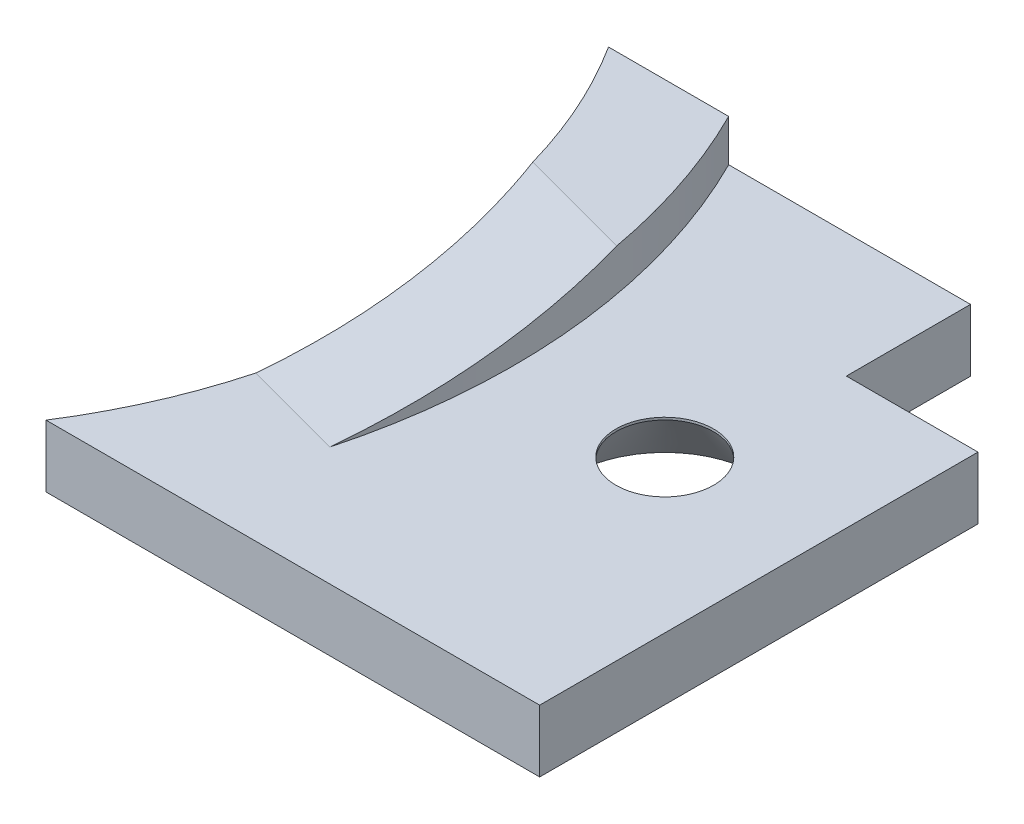
ISO-10303-21;
HEADER;
FILE_DESCRIPTION(('STEP AP214'),'2;1');
FILE_NAME('part.step','',(''),(''),'','','');
FILE_SCHEMA(('AUTOMOTIVE_DESIGN { 1 0 10303 214 1 1 1 1 }'));
ENDSEC;
DATA;
#1=APPLICATION_CONTEXT('core data for automotive mechanical design processes');
#2=APPLICATION_PROTOCOL_DEFINITION('international standard','automotive_design',2000,#1);
#3=PRODUCT_CONTEXT('',#1,'mechanical');
#4=PRODUCT('Part','Part','',(#3));
#5=PRODUCT_RELATED_PRODUCT_CATEGORY('part','',(#4));
#6=PRODUCT_DEFINITION_FORMATION('','',#4);
#7=PRODUCT_DEFINITION_CONTEXT('part definition',#1,'design');
#8=PRODUCT_DEFINITION('design','',#6,#7);
#9=PRODUCT_DEFINITION_SHAPE('','',#8);
#10=(LENGTH_UNIT() NAMED_UNIT(*) SI_UNIT(.MILLI.,.METRE.));
#11=(NAMED_UNIT(*) PLANE_ANGLE_UNIT() SI_UNIT($,.RADIAN.));
#12=(NAMED_UNIT(*) SI_UNIT($,.STERADIAN.) SOLID_ANGLE_UNIT());
#13=UNCERTAINTY_MEASURE_WITH_UNIT(LENGTH_MEASURE(1.E-05),#10,'distance_accuracy_value','');
#14=(GEOMETRIC_REPRESENTATION_CONTEXT(3) GLOBAL_UNCERTAINTY_ASSIGNED_CONTEXT((#13)) GLOBAL_UNIT_ASSIGNED_CONTEXT((#10,
#11,#12)) REPRESENTATION_CONTEXT('',''));
#15=CARTESIAN_POINT('',(0.,0.,0.));
#16=DIRECTION('',(0.,0.,1.));
#17=DIRECTION('',(1.,0.,0.));
#18=AXIS2_PLACEMENT_3D('',#15,#16,#17);
#19=CARTESIAN_POINT('',(-31.2610975201711,2.08,-9.4));
#20=DIRECTION('',(0.,-1.,0.));
#21=DIRECTION('',(0.,0.,-1.));
#22=AXIS2_PLACEMENT_3D('',#19,#20,#21);
#23=CYLINDRICAL_SURFACE('',#22,17.5);
#24=CARTESIAN_POINT('',(-31.2610975201711,2.08,-9.4));
#25=DIRECTION('',(0.,1.,0.));
#26=DIRECTION('',(0.,0.,1.));
#27=AXIS2_PLACEMENT_3D('',#24,#25,#26);
#28=CIRCLE('',#27,17.5);
#29=CARTESIAN_POINT('',(-16.5,2.08,0.));
#30=VERTEX_POINT('',#29);
#31=CARTESIAN_POINT('',(-14.3573955601124,2.08,-4.87066671070587));
#32=VERTEX_POINT('',#31);
#33=EDGE_CURVE('E212',#30,#32,#28,.T.);
#34=ORIENTED_EDGE('',*,*,#33,.T.);
#35=CARTESIAN_POINT('',(-31.2610975201711,2.07999999999994,-9.4));
#36=DIRECTION('',(-0.0397823005914427,0.988116468954881,0.148469567049241));
#37=DIRECTION('',(-0.255743360944977,-0.153707006281877,0.95444721674508));
#38=AXIS2_PLACEMENT_3D('',#35,#36,#37);
#39=ELLIPSE('',#38,17.7104628349222,17.5);
#40=CARTESIAN_POINT('',(-14.4347915727247,3.48,-14.2088905334735));
#41=VERTEX_POINT('',#40);
#42=EDGE_CURVE('E117',#32,#41,#39,.T.);
#43=ORIENTED_EDGE('',*,*,#42,.T.);
#44=CARTESIAN_POINT('',(-31.2610975201711,3.48,-9.4));
#45=DIRECTION('',(0.,1.,0.));
#46=DIRECTION('',(0.,0.,1.));
#47=AXIS2_PLACEMENT_3D('',#44,#45,#46);
#48=CIRCLE('',#47,17.5);
#49=CARTESIAN_POINT('',(-16.5,3.48,-18.8));
#50=VERTEX_POINT('',#49);
#51=EDGE_CURVE('E187',#50,#41,#48,.F.);
#52=ORIENTED_EDGE('',*,*,#51,.F.);
#53=DIRECTION('',(0.,-1.,0.));
#54=VECTOR('',#53,1.);
#55=CARTESIAN_POINT('',(-16.5,2.08,-18.8));
#56=LINE('',#55,#54);
#57=CARTESIAN_POINT('',(-16.5,0.,-18.8));
#58=VERTEX_POINT('',#57);
#59=EDGE_CURVE('E200',#50,#58,#56,.T.);
#60=ORIENTED_EDGE('',*,*,#59,.T.);
#61=CARTESIAN_POINT('',(-31.2610975201711,0.,-9.4));
#62=DIRECTION('',(0.,1.,0.));
#63=DIRECTION('',(0.,0.,1.));
#64=AXIS2_PLACEMENT_3D('',#61,#62,#63);
#65=CIRCLE('',#64,17.5);
#66=CARTESIAN_POINT('',(-16.5,0.,0.));
#67=VERTEX_POINT('',#66);
#68=EDGE_CURVE('E196',#67,#58,#65,.T.);
#69=ORIENTED_EDGE('',*,*,#68,.F.);
#70=DIRECTION('',(0.,-1.,0.));
#71=VECTOR('',#70,1.);
#72=CARTESIAN_POINT('',(-16.5,2.08,0.));
#73=LINE('',#72,#71);
#74=EDGE_CURVE('E271',#30,#67,#73,.T.);
#75=ORIENTED_EDGE('',*,*,#74,.F.);
#76=EDGE_LOOP('',(#34,#43,#52,#60,#69,#75));
#77=FACE_BOUND('',#76,.T.);
#78=ADVANCED_FACE('F89',(#77),#23,.F.);
#79=CARTESIAN_POINT('',(0.,2.08,0.));
#80=DIRECTION('',(0.,0.,-1.));
#81=DIRECTION('',(-1.,0.,0.));
#82=AXIS2_PLACEMENT_3D('',#79,#80,#81);
#83=PLANE('',#82);
#84=DIRECTION('',(1.,0.,0.));
#85=VECTOR('',#84,1.);
#86=CARTESIAN_POINT('',(0.,0.,0.));
#87=LINE('',#86,#85);
#88=CARTESIAN_POINT('',(0.,0.,0.));
#89=VERTEX_POINT('',#88);
#90=EDGE_CURVE('E241',#67,#89,#87,.T.);
#91=ORIENTED_EDGE('',*,*,#90,.T.);
#92=DIRECTION('',(0.,-1.,0.));
#93=VECTOR('',#92,1.);
#94=CARTESIAN_POINT('',(0.,2.08,0.));
#95=LINE('',#94,#93);
#96=CARTESIAN_POINT('',(0.,2.08,0.));
#97=VERTEX_POINT('',#96);
#98=EDGE_CURVE('E269',#97,#89,#95,.T.);
#99=ORIENTED_EDGE('',*,*,#98,.F.);
#100=DIRECTION('',(1.,0.,0.));
#101=VECTOR('',#100,1.);
#102=CARTESIAN_POINT('',(0.,2.08,0.));
#103=LINE('',#102,#101);
#104=EDGE_CURVE('E215',#30,#97,#103,.T.);
#105=ORIENTED_EDGE('',*,*,#104,.F.);
#106=ORIENTED_EDGE('',*,*,#74,.T.);
#107=EDGE_LOOP('',(#91,#99,#105,#106));
#108=FACE_BOUND('',#107,.T.);
#109=ADVANCED_FACE('F295',(#108),#83,.F.);
#110=CARTESIAN_POINT('',(0.,2.08,0.));
#111=DIRECTION('',(1.,0.,0.));
#112=DIRECTION('',(0.,0.,-1.));
#113=AXIS2_PLACEMENT_3D('',#110,#111,#112);
#114=PLANE('',#113);
#115=DIRECTION('',(0.,0.,1.));
#116=VECTOR('',#115,1.);
#117=CARTESIAN_POINT('',(0.,0.,0.));
#118=LINE('',#117,#116);
#119=CARTESIAN_POINT('',(0.,0.,-14.65));
#120=VERTEX_POINT('',#119);
#121=EDGE_CURVE('E245',#120,#89,#118,.T.);
#122=ORIENTED_EDGE('',*,*,#121,.F.);
#123=DIRECTION('',(0.,-1.,0.));
#124=VECTOR('',#123,1.);
#125=CARTESIAN_POINT('',(0.,2.08,-14.65));
#126=LINE('',#125,#124);
#127=CARTESIAN_POINT('',(0.,2.08,-14.65));
#128=VERTEX_POINT('',#127);
#129=EDGE_CURVE('E266',#128,#120,#126,.T.);
#130=ORIENTED_EDGE('',*,*,#129,.F.);
#131=DIRECTION('',(0.,0.,1.));
#132=VECTOR('',#131,1.);
#133=CARTESIAN_POINT('',(0.,2.08,0.));
#134=LINE('',#133,#132);
#135=EDGE_CURVE('E219',#128,#97,#134,.T.);
#136=ORIENTED_EDGE('',*,*,#135,.T.);
#137=ORIENTED_EDGE('',*,*,#98,.T.);
#138=EDGE_LOOP('',(#122,#130,#136,#137));
#139=FACE_BOUND('',#138,.T.);
#140=ADVANCED_FACE('F299',(#139),#114,.T.);
#141=CARTESIAN_POINT('',(0.,2.08,-14.65));
#142=DIRECTION('',(0.,0.,-1.));
#143=DIRECTION('',(-1.,0.,0.));
#144=AXIS2_PLACEMENT_3D('',#141,#142,#143);
#145=PLANE('',#144);
#146=DIRECTION('',(1.,0.,0.));
#147=VECTOR('',#146,1.);
#148=CARTESIAN_POINT('',(0.,0.,-14.65));
#149=LINE('',#148,#147);
#150=CARTESIAN_POINT('',(-4.4,0.,-14.65));
#151=VERTEX_POINT('',#150);
#152=EDGE_CURVE('E249',#151,#120,#149,.T.);
#153=ORIENTED_EDGE('',*,*,#152,.F.);
#154=DIRECTION('',(0.,-1.,0.));
#155=VECTOR('',#154,1.);
#156=CARTESIAN_POINT('',(-4.4,2.08,-14.65));
#157=LINE('',#156,#155);
#158=CARTESIAN_POINT('',(-4.4,2.08,-14.65));
#159=VERTEX_POINT('',#158);
#160=EDGE_CURVE('E263',#159,#151,#157,.T.);
#161=ORIENTED_EDGE('',*,*,#160,.F.);
#162=DIRECTION('',(1.,0.,0.));
#163=VECTOR('',#162,1.);
#164=CARTESIAN_POINT('',(0.,2.08,-14.65));
#165=LINE('',#164,#163);
#166=EDGE_CURVE('E223',#159,#128,#165,.T.);
#167=ORIENTED_EDGE('',*,*,#166,.T.);
#168=ORIENTED_EDGE('',*,*,#129,.T.);
#169=EDGE_LOOP('',(#153,#161,#167,#168));
#170=FACE_BOUND('',#169,.T.);
#171=ADVANCED_FACE('F310',(#170),#145,.T.);
#172=CARTESIAN_POINT('',(-4.39999999999999,2.08,0.));
#173=DIRECTION('',(1.,0.,0.));
#174=DIRECTION('',(0.,0.,-1.));
#175=AXIS2_PLACEMENT_3D('',#172,#173,#174);
#176=PLANE('',#175);
#177=DIRECTION('',(0.,0.,1.));
#178=VECTOR('',#177,1.);
#179=CARTESIAN_POINT('',(-4.39999999999999,0.,0.));
#180=LINE('',#179,#178);
#181=CARTESIAN_POINT('',(-4.4,0.,-18.8));
#182=VERTEX_POINT('',#181);
#183=EDGE_CURVE('E253',#182,#151,#180,.T.);
#184=ORIENTED_EDGE('',*,*,#183,.F.);
#185=DIRECTION('',(0.,-1.,0.));
#186=VECTOR('',#185,1.);
#187=CARTESIAN_POINT('',(-4.4,2.08,-18.8));
#188=LINE('',#187,#186);
#189=CARTESIAN_POINT('',(-4.4,2.08,-18.8));
#190=VERTEX_POINT('',#189);
#191=EDGE_CURVE('E261',#190,#182,#188,.T.);
#192=ORIENTED_EDGE('',*,*,#191,.F.);
#193=DIRECTION('',(0.,0.,1.));
#194=VECTOR('',#193,1.);
#195=CARTESIAN_POINT('',(-4.39999999999999,2.08,0.));
#196=LINE('',#195,#194);
#197=EDGE_CURVE('E227',#190,#159,#196,.T.);
#198=ORIENTED_EDGE('',*,*,#197,.T.);
#199=ORIENTED_EDGE('',*,*,#160,.T.);
#200=EDGE_LOOP('',(#184,#192,#198,#199));
#201=FACE_BOUND('',#200,.T.);
#202=ADVANCED_FACE('F314',(#201),#176,.T.);
#203=CARTESIAN_POINT('',(0.,2.08,-18.8));
#204=DIRECTION('',(0.,0.,-1.));
#205=DIRECTION('',(-1.,0.,0.));
#206=AXIS2_PLACEMENT_3D('',#203,#204,#205);
#207=PLANE('',#206);
#208=DIRECTION('',(1.,0.,0.));
#209=VECTOR('',#208,1.);
#210=CARTESIAN_POINT('',(0.,0.,-18.8));
#211=LINE('',#210,#209);
#212=EDGE_CURVE('E216',#58,#182,#211,.T.);
#213=ORIENTED_EDGE('',*,*,#212,.F.);
#214=ORIENTED_EDGE('',*,*,#59,.F.);
#215=DIRECTION('',(-1.,0.,0.));
#216=VECTOR('',#215,1.);
#217=CARTESIAN_POINT('',(0.,3.48,-18.8));
#218=LINE('',#217,#216);
#219=CARTESIAN_POINT('',(-12.4823861692823,3.48,-18.8));
#220=VERTEX_POINT('',#219);
#221=EDGE_CURVE('E183',#220,#50,#218,.T.);
#222=ORIENTED_EDGE('',*,*,#221,.F.);
#223=DIRECTION('',(0.,-1.,0.));
#224=VECTOR('',#223,1.);
#225=CARTESIAN_POINT('',(-12.4823861692823,3.48,-18.8));
#226=LINE('',#225,#224);
#227=CARTESIAN_POINT('',(-12.4823861692823,2.08,-18.8));
#228=VERTEX_POINT('',#227);
#229=EDGE_CURVE('E191',#220,#228,#226,.T.);
#230=ORIENTED_EDGE('',*,*,#229,.T.);
#231=DIRECTION('',(1.,0.,0.));
#232=VECTOR('',#231,1.);
#233=CARTESIAN_POINT('',(0.,2.08,-18.8));
#234=LINE('',#233,#232);
#235=EDGE_CURVE('E231',#228,#190,#234,.T.);
#236=ORIENTED_EDGE('',*,*,#235,.T.);
#237=ORIENTED_EDGE('',*,*,#191,.T.);
#238=EDGE_LOOP('',(#213,#214,#222,#230,#236,#237));
#239=FACE_BOUND('',#238,.T.);
#240=ADVANCED_FACE('F199',(#239),#207,.T.);
#241=CARTESIAN_POINT('',(-5.09,2.08,-9.27100149335224));
#242=DIRECTION('',(0.,-1.,0.));
#243=DIRECTION('',(0.,0.,-1.));
#244=AXIS2_PLACEMENT_3D('',#241,#242,#243);
#245=CYLINDRICAL_SURFACE('',#244,1.63199987089415);
#246=CARTESIAN_POINT('',(-5.09,2.00000000000002,-9.27100149335224));
#247=DIRECTION('',(0.,1.,0.));
#248=DIRECTION('',(0.,0.,1.));
#249=AXIS2_PLACEMENT_3D('',#246,#247,#248);
#250=CIRCLE('',#249,1.63199987089415);
#251=CARTESIAN_POINT('',(-5.09,2.00000000000002,-7.63900162245809));
#252=VERTEX_POINT('',#251);
#253=EDGE_CURVE('E12',#252,#252,#250,.F.);
#254=ORIENTED_EDGE('',*,*,#253,.T.);
#255=EDGE_LOOP('',(#254));
#256=FACE_BOUND('',#255,.T.);
#257=CARTESIAN_POINT('',(-5.09,2.08,-9.27100149335224));
#258=DIRECTION('',(0.,1.,0.));
#259=DIRECTION('',(0.,0.,1.));
#260=AXIS2_PLACEMENT_3D('',#257,#258,#259);
#261=CIRCLE('',#260,1.63199987089415);
#262=CARTESIAN_POINT('',(-5.09,2.08,-7.63900162245809));
#263=VERTEX_POINT('',#262);
#264=EDGE_CURVE('E234',#263,#263,#261,.T.);
#265=ORIENTED_EDGE('',*,*,#264,.T.);
#266=EDGE_LOOP('',(#265));
#267=FACE_BOUND('',#266,.T.);
#268=ADVANCED_FACE('F321',(#256,#267),#245,.F.);
#269=CARTESIAN_POINT('',(0.,2.08,0.));
#270=DIRECTION('',(0.,1.,0.));
#271=DIRECTION('',(0.,0.,1.));
#272=AXIS2_PLACEMENT_3D('',#269,#270,#271);
#273=PLANE('',#272);
#274=CARTESIAN_POINT('',(-31.2610975201711,2.08,-9.4));
#275=DIRECTION('',(0.,1.,0.));
#276=DIRECTION('',(0.,0.,1.));
#277=AXIS2_PLACEMENT_3D('',#274,#275,#276);
#278=CIRCLE('',#277,21.);
#279=CARTESIAN_POINT('',(-10.9766551681006,2.08,-3.96480005284705));
#280=VERTEX_POINT('',#279);
#281=EDGE_CURVE('E194',#280,#228,#278,.T.);
#282=ORIENTED_EDGE('',*,*,#281,.F.);
#283=DIRECTION('',(0.965925826289068,0.,0.258819045102521));
#284=VECTOR('',#283,1.);
#285=CARTESIAN_POINT('',(0.255903541239894,2.08,-0.955045017744081));
#286=LINE('',#285,#284);
#287=EDGE_CURVE('E207',#32,#280,#286,.T.);
#288=ORIENTED_EDGE('',*,*,#287,.F.);
#289=ORIENTED_EDGE('',*,*,#33,.F.);
#290=ORIENTED_EDGE('',*,*,#104,.T.);
#291=ORIENTED_EDGE('',*,*,#135,.F.);
#292=ORIENTED_EDGE('',*,*,#166,.F.);
#293=ORIENTED_EDGE('',*,*,#197,.F.);
#294=ORIENTED_EDGE('',*,*,#235,.F.);
#295=EDGE_LOOP('',(#282,#288,#289,#290,#291,#292,#293,#294));
#296=FACE_BOUND('',#295,.T.);
#297=ORIENTED_EDGE('',*,*,#264,.F.);
#298=EDGE_LOOP('',(#297));
#299=FACE_BOUND('',#298,.T.);
#300=ADVANCED_FACE('F323',(#296,#299),#273,.T.);
#301=CARTESIAN_POINT('',(0.,0.,0.));
#302=DIRECTION('',(0.,1.,0.));
#303=DIRECTION('',(0.,0.,1.));
#304=AXIS2_PLACEMENT_3D('',#301,#302,#303);
#305=PLANE('',#304);
#306=CARTESIAN_POINT('',(-5.09,0.,-9.27100149335224));
#307=DIRECTION('',(0.,1.,0.));
#308=DIRECTION('',(0.,0.,1.));
#309=AXIS2_PLACEMENT_3D('',#306,#307,#308);
#310=CIRCLE('',#309,3.13199987089416);
#311=CARTESIAN_POINT('',(-5.09,0.,-6.13900162245808));
#312=VERTEX_POINT('',#311);
#313=EDGE_CURVE('E99',#312,#312,#310,.T.);
#314=ORIENTED_EDGE('',*,*,#313,.T.);
#315=EDGE_LOOP('',(#314));
#316=FACE_BOUND('',#315,.T.);
#317=ORIENTED_EDGE('',*,*,#68,.T.);
#318=ORIENTED_EDGE('',*,*,#212,.T.);
#319=ORIENTED_EDGE('',*,*,#183,.T.);
#320=ORIENTED_EDGE('',*,*,#152,.T.);
#321=ORIENTED_EDGE('',*,*,#121,.T.);
#322=ORIENTED_EDGE('',*,*,#90,.F.);
#323=EDGE_LOOP('',(#317,#318,#319,#320,#321,#322));
#324=FACE_BOUND('',#323,.T.);
#325=ADVANCED_FACE('F283',(#316,#324),#305,.F.);
#326=CARTESIAN_POINT('',(-31.2610975201711,3.48,-9.4));
#327=DIRECTION('',(0.,-1.,0.));
#328=DIRECTION('',(0.,0.,-1.));
#329=AXIS2_PLACEMENT_3D('',#326,#327,#328);
#330=CYLINDRICAL_SURFACE('',#329,21.);
#331=CARTESIAN_POINT('',(-31.2610975201711,3.48,-9.4));
#332=DIRECTION('',(0.,1.,0.));
#333=DIRECTION('',(0.,0.,1.));
#334=AXIS2_PLACEMENT_3D('',#331,#332,#333);
#335=CIRCLE('',#334,21.);
#336=CARTESIAN_POINT('',(-10.6045721431267,3.48,-13.1825863304787));
#337=VERTEX_POINT('',#336);
#338=EDGE_CURVE('E179',#337,#220,#335,.T.);
#339=ORIENTED_EDGE('',*,*,#338,.F.);
#340=CARTESIAN_POINT('',(-31.2610975201711,2.07999999999994,-9.4));
#341=DIRECTION('',(-0.0397823005914427,0.988116468954881,0.148469567049241));
#342=DIRECTION('',(-0.255743360944977,-0.153707006281877,0.95444721674508));
#343=AXIS2_PLACEMENT_3D('',#340,#341,#342);
#344=ELLIPSE('',#343,21.2525554019067,21.);
#345=EDGE_CURVE('E109',#337,#280,#344,.F.);
#346=ORIENTED_EDGE('',*,*,#345,.T.);
#347=ORIENTED_EDGE('',*,*,#281,.T.);
#348=ORIENTED_EDGE('',*,*,#229,.F.);
#349=EDGE_LOOP('',(#339,#346,#347,#348));
#350=FACE_BOUND('',#349,.T.);
#351=ADVANCED_FACE('F192',(#350),#330,.T.);
#352=CARTESIAN_POINT('',(0.,3.48,0.));
#353=DIRECTION('',(0.,1.,0.));
#354=DIRECTION('',(0.,0.,1.));
#355=AXIS2_PLACEMENT_3D('',#352,#353,#354);
#356=PLANE('',#355);
#357=ORIENTED_EDGE('',*,*,#51,.T.);
#358=DIRECTION('',(0.965925826289068,0.,0.258819045102521));
#359=VECTOR('',#358,1.);
#360=CARTESIAN_POINT('',(-8.64728376217793,3.48,-12.6581324894487));
#361=LINE('',#360,#359);
#362=EDGE_CURVE('E184',#41,#337,#361,.T.);
#363=ORIENTED_EDGE('',*,*,#362,.T.);
#364=ORIENTED_EDGE('',*,*,#338,.T.);
#365=ORIENTED_EDGE('',*,*,#221,.T.);
#366=EDGE_LOOP('',(#357,#363,#364,#365));
#367=FACE_BOUND('',#366,.T.);
#368=ADVANCED_FACE('F181',(#367),#356,.T.);
#369=CARTESIAN_POINT('',(2.58527494716259,3.48,-9.64837745434571));
#370=DIRECTION('',(-0.0397823005914427,0.988116468954881,0.148469567049241));
#371=DIRECTION('',(-0.965925826289068,0.,-0.258819045102521));
#372=AXIS2_PLACEMENT_3D('',#369,#370,#371);
#373=PLANE('',#372);
#374=ORIENTED_EDGE('',*,*,#42,.F.);
#375=ORIENTED_EDGE('',*,*,#287,.T.);
#376=ORIENTED_EDGE('',*,*,#345,.F.);
#377=ORIENTED_EDGE('',*,*,#362,.F.);
#378=EDGE_LOOP('',(#374,#375,#376,#377));
#379=FACE_BOUND('',#378,.T.);
#380=ADVANCED_FACE('F287',(#379),#373,.T.);
#381=CARTESIAN_POINT('',(-5.09,0.,-9.27100149335224));
#382=DIRECTION('',(0.,-1.,0.));
#383=DIRECTION('',(0.,0.,-1.));
#384=AXIS2_PLACEMENT_3D('',#381,#382,#383);
#385=CONICAL_SURFACE('',#384,3.13199987089416,0.643501108793284);
#386=ORIENTED_EDGE('',*,*,#253,.F.);
#387=EDGE_LOOP('',(#386));
#388=FACE_BOUND('',#387,.T.);
#389=ORIENTED_EDGE('',*,*,#313,.F.);
#390=EDGE_LOOP('',(#389));
#391=FACE_BOUND('',#390,.T.);
#392=ADVANCED_FACE('F92',(#388,#391),#385,.F.);
#393=CLOSED_SHELL('',(#78,#109,#140,#171,#202,#240,#268,#300,#325,#351,#368,#380,#392));
#394=MANIFOLD_SOLID_BREP('B2',#393);
#395=ADVANCED_BREP_SHAPE_REPRESENTATION('',(#18,#394),#14);
#396=SHAPE_DEFINITION_REPRESENTATION(#9,#395);
ENDSEC;
END-ISO-10303-21;
